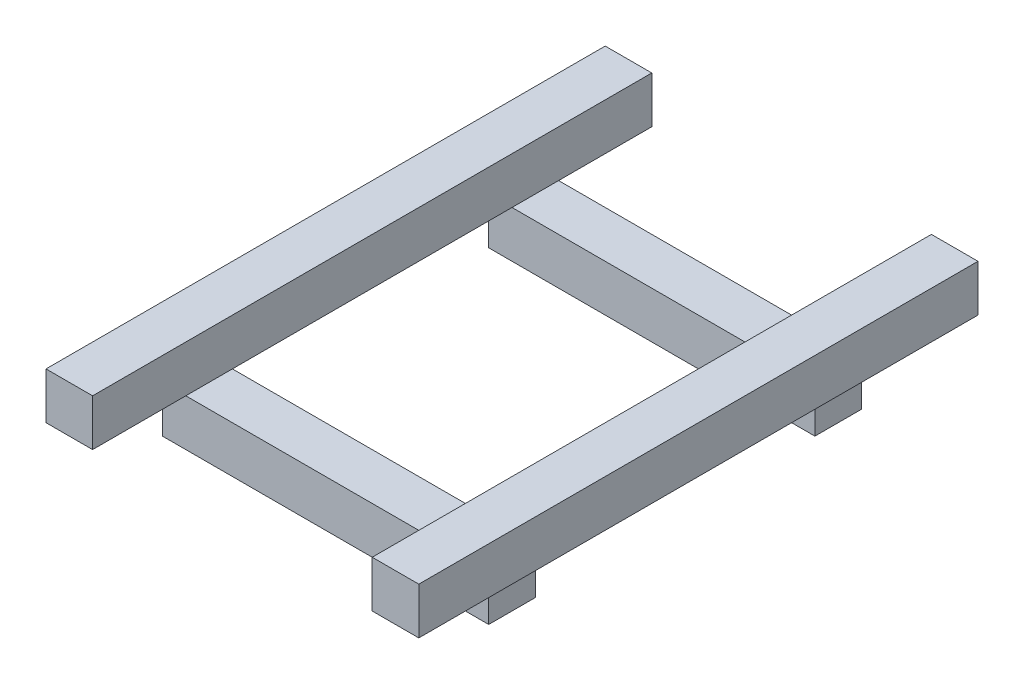
ISO-10303-21;
HEADER;
FILE_DESCRIPTION(('STEP AP214'),'2;1');
FILE_NAME('part.step','',(''),(''),'','','');
FILE_SCHEMA(('AUTOMOTIVE_DESIGN { 1 0 10303 214 1 1 1 1 }'));
ENDSEC;
DATA;
#1=APPLICATION_CONTEXT('core data for automotive mechanical design processes');
#2=APPLICATION_PROTOCOL_DEFINITION('international standard','automotive_design',2000,#1);
#3=PRODUCT_CONTEXT('',#1,'mechanical');
#4=PRODUCT('Part','Part','',(#3));
#5=PRODUCT_RELATED_PRODUCT_CATEGORY('part','',(#4));
#6=PRODUCT_DEFINITION_FORMATION('','',#4);
#7=PRODUCT_DEFINITION_CONTEXT('part definition',#1,'design');
#8=PRODUCT_DEFINITION('design','',#6,#7);
#9=PRODUCT_DEFINITION_SHAPE('','',#8);
#10=(LENGTH_UNIT() NAMED_UNIT(*) SI_UNIT(.MILLI.,.METRE.));
#11=(NAMED_UNIT(*) PLANE_ANGLE_UNIT() SI_UNIT($,.RADIAN.));
#12=(NAMED_UNIT(*) SI_UNIT($,.STERADIAN.) SOLID_ANGLE_UNIT());
#13=UNCERTAINTY_MEASURE_WITH_UNIT(LENGTH_MEASURE(1.E-05),#10,'distance_accuracy_value','');
#14=(GEOMETRIC_REPRESENTATION_CONTEXT(3) GLOBAL_UNCERTAINTY_ASSIGNED_CONTEXT((#13)) GLOBAL_UNIT_ASSIGNED_CONTEXT((#10,
#11,#12)) REPRESENTATION_CONTEXT('',''));
#15=CARTESIAN_POINT('',(0.,0.,0.));
#16=DIRECTION('',(0.,0.,1.));
#17=DIRECTION('',(1.,0.,0.));
#18=AXIS2_PLACEMENT_3D('',#15,#16,#17);
#19=CARTESIAN_POINT('',(268.067226890756,-50.,329.201680672269));
#20=DIRECTION('',(-1.,0.,0.));
#21=DIRECTION('',(0.,0.,1.));
#22=AXIS2_PLACEMENT_3D('',#19,#20,#21);
#23=PLANE('',#22);
#24=DIRECTION('',(0.,0.,-1.));
#25=VECTOR('',#24,1.);
#26=CARTESIAN_POINT('',(268.067226890756,0.,-170.798319327731));
#27=LINE('',#26,#25);
#28=CARTESIAN_POINT('',(268.067226890756,0.,429.201680672269));
#29=VERTEX_POINT('',#28);
#30=CARTESIAN_POINT('',(268.067226890756,0.,-170.798319327731));
#31=VERTEX_POINT('',#30);
#32=EDGE_CURVE('E231',#29,#31,#27,.T.);
#33=ORIENTED_EDGE('',*,*,#32,.T.);
#34=DIRECTION('',(0.,-1.,0.));
#35=VECTOR('',#34,1.);
#36=CARTESIAN_POINT('',(268.067226890756,50.,-170.798319327731));
#37=LINE('',#36,#35);
#38=CARTESIAN_POINT('',(268.067226890756,50.,-170.798319327731));
#39=VERTEX_POINT('',#38);
#40=EDGE_CURVE('E222',#39,#31,#37,.T.);
#41=ORIENTED_EDGE('',*,*,#40,.F.);
#42=DIRECTION('',(0.,0.,-1.));
#43=VECTOR('',#42,1.);
#44=CARTESIAN_POINT('',(268.067226890756,50.,-170.798319327731));
#45=LINE('',#44,#43);
#46=CARTESIAN_POINT('',(268.067226890756,50.,429.201680672269));
#47=VERTEX_POINT('',#46);
#48=EDGE_CURVE('E243',#47,#39,#45,.T.);
#49=ORIENTED_EDGE('',*,*,#48,.F.);
#50=DIRECTION('',(0.,-1.,0.));
#51=VECTOR('',#50,1.);
#52=CARTESIAN_POINT('',(268.067226890756,50.,429.201680672269));
#53=LINE('',#52,#51);
#54=EDGE_CURVE('E215',#47,#29,#53,.T.);
#55=ORIENTED_EDGE('',*,*,#54,.T.);
#56=EDGE_LOOP('',(#33,#41,#49,#55));
#57=FACE_BOUND('',#56,.T.);
#58=ADVANCED_FACE('F39',(#57),#23,.F.);
#59=CARTESIAN_POINT('',(0.,0.,0.));
#60=DIRECTION('',(0.,-1.,0.));
#61=DIRECTION('',(0.,0.,-1.));
#62=AXIS2_PLACEMENT_3D('',#59,#60,#61);
#63=PLANE('',#62);
#64=DIRECTION('',(0.,0.,1.));
#65=VECTOR('',#64,1.);
#66=CARTESIAN_POINT('',(218.067226890756,0.,0.));
#67=LINE('',#66,#65);
#68=CARTESIAN_POINT('',(218.067226890756,0.,279.201680672269));
#69=VERTEX_POINT('',#68);
#70=CARTESIAN_POINT('',(218.067226890756,0.,329.201680672269));
#71=VERTEX_POINT('',#70);
#72=EDGE_CURVE('E47',#69,#71,#67,.T.);
#73=ORIENTED_EDGE('',*,*,#72,.F.);
#74=DIRECTION('',(1.,0.,0.));
#75=VECTOR('',#74,1.);
#76=CARTESIAN_POINT('',(-131.932773109244,0.,279.201680672269));
#77=LINE('',#76,#75);
#78=CARTESIAN_POINT('',(-81.9327731092437,0.,279.201680672269));
#79=VERTEX_POINT('',#78);
#80=EDGE_CURVE('E260',#79,#69,#77,.T.);
#81=ORIENTED_EDGE('',*,*,#80,.F.);
#82=DIRECTION('',(0.,0.,-1.));
#83=VECTOR('',#82,1.);
#84=CARTESIAN_POINT('',(-81.9327731092436,0.,-170.798319327731));
#85=LINE('',#84,#83);
#86=CARTESIAN_POINT('',(-81.9327731092436,0.,329.201680672269));
#87=VERTEX_POINT('',#86);
#88=EDGE_CURVE('E281',#87,#79,#85,.T.);
#89=ORIENTED_EDGE('',*,*,#88,.F.);
#90=DIRECTION('',(-1.,0.,0.));
#91=VECTOR('',#90,1.);
#92=CARTESIAN_POINT('',(-131.932773109244,0.,329.201680672269));
#93=LINE('',#92,#91);
#94=EDGE_CURVE('E259',#71,#87,#93,.T.);
#95=ORIENTED_EDGE('',*,*,#94,.F.);
#96=EDGE_LOOP('',(#73,#81,#89,#95));
#97=FACE_BOUND('',#96,.T.);
#98=ADVANCED_FACE('F320',(#97),#63,.F.);
#99=CARTESIAN_POINT('',(0.,0.,0.));
#100=DIRECTION('',(0.,1.,0.));
#101=DIRECTION('',(0.,0.,1.));
#102=AXIS2_PLACEMENT_3D('',#99,#100,#101);
#103=PLANE('',#102);
#104=CARTESIAN_POINT('',(-106.932773109244,0.,329.201680672269));
#105=VERTEX_POINT('',#104);
#106=EDGE_CURVE('E262',#87,#105,#93,.T.);
#107=ORIENTED_EDGE('',*,*,#106,.F.);
#108=CARTESIAN_POINT('',(-81.9327731092436,0.,429.201680672269));
#109=VERTEX_POINT('',#108);
#110=EDGE_CURVE('E278',#109,#87,#85,.T.);
#111=ORIENTED_EDGE('',*,*,#110,.F.);
#112=DIRECTION('',(1.,0.,0.));
#113=VECTOR('',#112,1.);
#114=CARTESIAN_POINT('',(-131.932773109244,0.,429.201680672269));
#115=LINE('',#114,#113);
#116=CARTESIAN_POINT('',(-131.932773109244,0.,429.201680672269));
#117=VERTEX_POINT('',#116);
#118=EDGE_CURVE('E275',#117,#109,#115,.T.);
#119=ORIENTED_EDGE('',*,*,#118,.F.);
#120=DIRECTION('',(0.,0.,1.));
#121=VECTOR('',#120,1.);
#122=CARTESIAN_POINT('',(-131.932773109244,0.,-170.798319327731));
#123=LINE('',#122,#121);
#124=CARTESIAN_POINT('',(-131.932773109244,0.,-170.798319327731));
#125=VERTEX_POINT('',#124);
#126=EDGE_CURVE('E256',#125,#117,#123,.T.);
#127=ORIENTED_EDGE('',*,*,#126,.F.);
#128=DIRECTION('',(-1.,0.,0.));
#129=VECTOR('',#128,1.);
#130=CARTESIAN_POINT('',(-131.932773109244,0.,-170.798319327731));
#131=LINE('',#130,#129);
#132=CARTESIAN_POINT('',(-81.9327731092436,0.,-170.798319327731));
#133=VERTEX_POINT('',#132);
#134=EDGE_CURVE('E267',#133,#125,#131,.T.);
#135=ORIENTED_EDGE('',*,*,#134,.F.);
#136=CARTESIAN_POINT('',(-81.9327731092436,0.,-70.7983193277311));
#137=VERTEX_POINT('',#136);
#138=EDGE_CURVE('E277',#137,#133,#85,.T.);
#139=ORIENTED_EDGE('',*,*,#138,.F.);
#140=DIRECTION('',(1.,0.,0.));
#141=VECTOR('',#140,1.);
#142=CARTESIAN_POINT('',(-131.932773109244,0.,-70.7983193277311));
#143=LINE('',#142,#141);
#144=CARTESIAN_POINT('',(-106.932773109244,0.,-70.7983193277311));
#145=VERTEX_POINT('',#144);
#146=EDGE_CURVE('E201',#145,#137,#143,.T.);
#147=ORIENTED_EDGE('',*,*,#146,.F.);
#148=DIRECTION('',(0.,0.,1.));
#149=VECTOR('',#148,1.);
#150=CARTESIAN_POINT('',(-106.932773109244,0.,329.201680672269));
#151=LINE('',#150,#149);
#152=CARTESIAN_POINT('',(-106.932773109244,0.,-20.798319327731));
#153=VERTEX_POINT('',#152);
#154=EDGE_CURVE('E533',#145,#153,#151,.T.);
#155=ORIENTED_EDGE('',*,*,#154,.T.);
#156=DIRECTION('',(-1.,0.,0.));
#157=VECTOR('',#156,1.);
#158=CARTESIAN_POINT('',(-131.932773109244,0.,-20.7983193277311));
#159=LINE('',#158,#157);
#160=CARTESIAN_POINT('',(-81.9327731092436,0.,-20.7983193277311));
#161=VERTEX_POINT('',#160);
#162=EDGE_CURVE('E204',#161,#153,#159,.T.);
#163=ORIENTED_EDGE('',*,*,#162,.F.);
#164=EDGE_CURVE('E322',#79,#161,#85,.T.);
#165=ORIENTED_EDGE('',*,*,#164,.F.);
#166=CARTESIAN_POINT('',(-106.932773109244,0.,279.201680672269));
#167=VERTEX_POINT('',#166);
#168=EDGE_CURVE('E257',#167,#79,#77,.T.);
#169=ORIENTED_EDGE('',*,*,#168,.F.);
#170=EDGE_CURVE('E312',#167,#105,#151,.T.);
#171=ORIENTED_EDGE('',*,*,#170,.T.);
#172=EDGE_LOOP('',(#107,#111,#119,#127,#135,#139,#147,#155,#163,#165,#169,#171));
#173=FACE_BOUND('',#172,.T.);
#174=ADVANCED_FACE('F309',(#173),#103,.F.);
#175=CARTESIAN_POINT('',(-131.932773109244,50.,-170.798319327731));
#176=DIRECTION('',(1.,0.,0.));
#177=DIRECTION('',(0.,0.,-1.));
#178=AXIS2_PLACEMENT_3D('',#175,#176,#177);
#179=PLANE('',#178);
#180=ORIENTED_EDGE('',*,*,#126,.T.);
#181=DIRECTION('',(0.,-1.,0.));
#182=VECTOR('',#181,1.);
#183=CARTESIAN_POINT('',(-131.932773109244,50.,429.201680672269));
#184=LINE('',#183,#182);
#185=CARTESIAN_POINT('',(-131.932773109244,50.,429.201680672269));
#186=VERTEX_POINT('',#185);
#187=EDGE_CURVE('E291',#186,#117,#184,.T.);
#188=ORIENTED_EDGE('',*,*,#187,.F.);
#189=DIRECTION('',(0.,0.,1.));
#190=VECTOR('',#189,1.);
#191=CARTESIAN_POINT('',(-131.932773109244,50.,-170.798319327731));
#192=LINE('',#191,#190);
#193=CARTESIAN_POINT('',(-131.932773109244,50.,-170.798319327731));
#194=VERTEX_POINT('',#193);
#195=EDGE_CURVE('E263',#194,#186,#192,.T.);
#196=ORIENTED_EDGE('',*,*,#195,.F.);
#197=DIRECTION('',(0.,-1.,0.));
#198=VECTOR('',#197,1.);
#199=CARTESIAN_POINT('',(-131.932773109244,50.,-170.798319327731));
#200=LINE('',#199,#198);
#201=EDGE_CURVE('E273',#194,#125,#200,.T.);
#202=ORIENTED_EDGE('',*,*,#201,.T.);
#203=EDGE_LOOP('',(#180,#188,#196,#202));
#204=FACE_BOUND('',#203,.T.);
#205=ADVANCED_FACE('F41',(#204),#179,.F.);
#206=CARTESIAN_POINT('',(-131.932773109244,50.,429.201680672269));
#207=DIRECTION('',(0.,0.,-1.));
#208=DIRECTION('',(-1.,0.,0.));
#209=AXIS2_PLACEMENT_3D('',#206,#207,#208);
#210=PLANE('',#209);
#211=ORIENTED_EDGE('',*,*,#118,.T.);
#212=DIRECTION('',(0.,-1.,0.));
#213=VECTOR('',#212,1.);
#214=CARTESIAN_POINT('',(-81.9327731092436,50.,429.201680672269));
#215=LINE('',#214,#213);
#216=CARTESIAN_POINT('',(-81.9327731092436,50.,429.201680672269));
#217=VERTEX_POINT('',#216);
#218=EDGE_CURVE('E288',#217,#109,#215,.T.);
#219=ORIENTED_EDGE('',*,*,#218,.F.);
#220=DIRECTION('',(1.,0.,0.));
#221=VECTOR('',#220,1.);
#222=CARTESIAN_POINT('',(-131.932773109244,50.,429.201680672269));
#223=LINE('',#222,#221);
#224=EDGE_CURVE('E266',#186,#217,#223,.T.);
#225=ORIENTED_EDGE('',*,*,#224,.F.);
#226=ORIENTED_EDGE('',*,*,#187,.T.);
#227=EDGE_LOOP('',(#211,#219,#225,#226));
#228=FACE_BOUND('',#227,.T.);
#229=ADVANCED_FACE('F337',(#228),#210,.F.);
#230=CARTESIAN_POINT('',(-81.9327731092436,50.,-170.798319327731));
#231=DIRECTION('',(-1.,0.,0.));
#232=DIRECTION('',(0.,0.,1.));
#233=AXIS2_PLACEMENT_3D('',#230,#231,#232);
#234=PLANE('',#233);
#235=ORIENTED_EDGE('',*,*,#110,.T.);
#236=ORIENTED_EDGE('',*,*,#88,.T.);
#237=ORIENTED_EDGE('',*,*,#164,.T.);
#238=DIRECTION('',(0.,0.,-1.));
#239=VECTOR('',#238,1.);
#240=CARTESIAN_POINT('',(-81.9327731092436,0.,-170.798319327731));
#241=LINE('',#240,#239);
#242=EDGE_CURVE('E206',#161,#137,#241,.T.);
#243=ORIENTED_EDGE('',*,*,#242,.T.);
#244=ORIENTED_EDGE('',*,*,#138,.T.);
#245=DIRECTION('',(0.,-1.,0.));
#246=VECTOR('',#245,1.);
#247=CARTESIAN_POINT('',(-81.9327731092436,50.,-170.798319327731));
#248=LINE('',#247,#246);
#249=CARTESIAN_POINT('',(-81.9327731092436,50.,-170.798319327731));
#250=VERTEX_POINT('',#249);
#251=EDGE_CURVE('E285',#250,#133,#248,.T.);
#252=ORIENTED_EDGE('',*,*,#251,.F.);
#253=DIRECTION('',(0.,0.,-1.));
#254=VECTOR('',#253,1.);
#255=CARTESIAN_POINT('',(-81.9327731092436,50.,-170.798319327731));
#256=LINE('',#255,#254);
#257=EDGE_CURVE('E269',#217,#250,#256,.T.);
#258=ORIENTED_EDGE('',*,*,#257,.F.);
#259=ORIENTED_EDGE('',*,*,#218,.T.);
#260=EDGE_LOOP('',(#235,#236,#237,#243,#244,#252,#258,#259));
#261=FACE_BOUND('',#260,.T.);
#262=ADVANCED_FACE('F315',(#261),#234,.F.);
#263=CARTESIAN_POINT('',(-131.932773109244,50.,-170.798319327731));
#264=DIRECTION('',(0.,0.,1.));
#265=DIRECTION('',(1.,0.,0.));
#266=AXIS2_PLACEMENT_3D('',#263,#264,#265);
#267=PLANE('',#266);
#268=ORIENTED_EDGE('',*,*,#134,.T.);
#269=ORIENTED_EDGE('',*,*,#201,.F.);
#270=DIRECTION('',(-1.,0.,0.));
#271=VECTOR('',#270,1.);
#272=CARTESIAN_POINT('',(-131.932773109244,50.,-170.798319327731));
#273=LINE('',#272,#271);
#274=EDGE_CURVE('E271',#250,#194,#273,.T.);
#275=ORIENTED_EDGE('',*,*,#274,.F.);
#276=ORIENTED_EDGE('',*,*,#251,.T.);
#277=EDGE_LOOP('',(#268,#269,#275,#276));
#278=FACE_BOUND('',#277,.T.);
#279=ADVANCED_FACE('F328',(#278),#267,.F.);
#280=CARTESIAN_POINT('',(0.,50.,0.));
#281=DIRECTION('',(0.,1.,0.));
#282=DIRECTION('',(0.,0.,1.));
#283=AXIS2_PLACEMENT_3D('',#280,#281,#282);
#284=PLANE('',#283);
#285=ORIENTED_EDGE('',*,*,#195,.T.);
#286=ORIENTED_EDGE('',*,*,#224,.T.);
#287=ORIENTED_EDGE('',*,*,#257,.T.);
#288=ORIENTED_EDGE('',*,*,#274,.T.);
#289=EDGE_LOOP('',(#285,#286,#287,#288));
#290=FACE_BOUND('',#289,.T.);
#291=ADVANCED_FACE('F335',(#290),#284,.T.);
#292=CARTESIAN_POINT('',(-131.932773109244,-50.,279.201680672269));
#293=DIRECTION('',(0.,0.,1.));
#294=DIRECTION('',(1.,0.,0.));
#295=AXIS2_PLACEMENT_3D('',#292,#293,#294);
#296=PLANE('',#295);
#297=CARTESIAN_POINT('',(243.067226890756,0.,279.201680672269));
#298=VERTEX_POINT('',#297);
#299=EDGE_CURVE('E239',#69,#298,#77,.T.);
#300=ORIENTED_EDGE('',*,*,#299,.T.);
#301=DIRECTION('',(0.,-1.,0.));
#302=VECTOR('',#301,1.);
#303=CARTESIAN_POINT('',(243.067226890756,-50.,279.201680672269));
#304=LINE('',#303,#302);
#305=CARTESIAN_POINT('',(243.067226890756,-50.,279.201680672269));
#306=VERTEX_POINT('',#305);
#307=EDGE_CURVE('E546',#298,#306,#304,.T.);
#308=ORIENTED_EDGE('',*,*,#307,.T.);
#309=DIRECTION('',(1.,0.,0.));
#310=VECTOR('',#309,1.);
#311=CARTESIAN_POINT('',(-131.932773109244,-50.,279.201680672269));
#312=LINE('',#311,#310);
#313=CARTESIAN_POINT('',(-106.932773109244,-50.,279.201680672269));
#314=VERTEX_POINT('',#313);
#315=EDGE_CURVE('E249',#314,#306,#312,.T.);
#316=ORIENTED_EDGE('',*,*,#315,.F.);
#317=DIRECTION('',(0.,1.,0.));
#318=VECTOR('',#317,1.);
#319=CARTESIAN_POINT('',(-106.932773109244,-50.,279.201680672269));
#320=LINE('',#319,#318);
#321=EDGE_CURVE('E54',#314,#167,#320,.T.);
#322=ORIENTED_EDGE('',*,*,#321,.T.);
#323=ORIENTED_EDGE('',*,*,#168,.T.);
#324=ORIENTED_EDGE('',*,*,#80,.T.);
#325=EDGE_LOOP('',(#300,#308,#316,#322,#323,#324));
#326=FACE_BOUND('',#325,.T.);
#327=ADVANCED_FACE('F356',(#326),#296,.F.);
#328=CARTESIAN_POINT('',(-131.932773109244,-50.,329.201680672269));
#329=DIRECTION('',(0.,0.,-1.));
#330=DIRECTION('',(-1.,0.,0.));
#331=AXIS2_PLACEMENT_3D('',#328,#329,#330);
#332=PLANE('',#331);
#333=DIRECTION('',(-1.,0.,0.));
#334=VECTOR('',#333,1.);
#335=CARTESIAN_POINT('',(-131.932773109244,-50.,329.201680672269));
#336=LINE('',#335,#334);
#337=CARTESIAN_POINT('',(243.067226890756,-50.,329.201680672269));
#338=VERTEX_POINT('',#337);
#339=CARTESIAN_POINT('',(-106.932773109244,-50.,329.201680672269));
#340=VERTEX_POINT('',#339);
#341=EDGE_CURVE('E252',#338,#340,#336,.T.);
#342=ORIENTED_EDGE('',*,*,#341,.F.);
#343=DIRECTION('',(0.,-1.,0.));
#344=VECTOR('',#343,1.);
#345=CARTESIAN_POINT('',(243.067226890756,0.,329.201680672269));
#346=LINE('',#345,#344);
#347=CARTESIAN_POINT('',(243.067226890756,0.,329.201680672269));
#348=VERTEX_POINT('',#347);
#349=EDGE_CURVE('E194',#348,#338,#346,.T.);
#350=ORIENTED_EDGE('',*,*,#349,.F.);
#351=EDGE_CURVE('E253',#348,#71,#93,.T.);
#352=ORIENTED_EDGE('',*,*,#351,.T.);
#353=ORIENTED_EDGE('',*,*,#94,.T.);
#354=ORIENTED_EDGE('',*,*,#106,.T.);
#355=DIRECTION('',(0.,-1.,0.));
#356=VECTOR('',#355,1.);
#357=CARTESIAN_POINT('',(-106.932773109244,0.,329.201680672269));
#358=LINE('',#357,#356);
#359=EDGE_CURVE('E530',#105,#340,#358,.T.);
#360=ORIENTED_EDGE('',*,*,#359,.T.);
#361=EDGE_LOOP('',(#342,#350,#352,#353,#354,#360));
#362=FACE_BOUND('',#361,.T.);
#363=ADVANCED_FACE('F302',(#362),#332,.F.);
#364=CARTESIAN_POINT('',(0.,-50.,0.));
#365=DIRECTION('',(0.,-1.,0.));
#366=DIRECTION('',(0.,0.,-1.));
#367=AXIS2_PLACEMENT_3D('',#364,#365,#366);
#368=PLANE('',#367);
#369=DIRECTION('',(0.,0.,-1.));
#370=VECTOR('',#369,1.);
#371=CARTESIAN_POINT('',(243.067226890756,-50.,329.201680672269));
#372=LINE('',#371,#370);
#373=EDGE_CURVE('E186',#338,#306,#372,.T.);
#374=ORIENTED_EDGE('',*,*,#373,.F.);
#375=ORIENTED_EDGE('',*,*,#341,.T.);
#376=DIRECTION('',(0.,0.,1.));
#377=VECTOR('',#376,1.);
#378=CARTESIAN_POINT('',(-106.932773109244,-50.,329.201680672269));
#379=LINE('',#378,#377);
#380=EDGE_CURVE('E538',#314,#340,#379,.T.);
#381=ORIENTED_EDGE('',*,*,#380,.F.);
#382=ORIENTED_EDGE('',*,*,#315,.T.);
#383=EDGE_LOOP('',(#374,#375,#381,#382));
#384=FACE_BOUND('',#383,.T.);
#385=ADVANCED_FACE('F430',(#384),#368,.T.);
#386=CARTESIAN_POINT('',(0.,0.,0.));
#387=DIRECTION('',(0.,1.,0.));
#388=DIRECTION('',(0.,0.,1.));
#389=AXIS2_PLACEMENT_3D('',#386,#387,#388);
#390=PLANE('',#389);
#391=DIRECTION('',(0.,0.,1.));
#392=VECTOR('',#391,1.);
#393=CARTESIAN_POINT('',(218.067226890756,0.,-170.798319327731));
#394=LINE('',#393,#392);
#395=CARTESIAN_POINT('',(218.067226890756,0.,429.201680672269));
#396=VERTEX_POINT('',#395);
#397=EDGE_CURVE('E236',#71,#396,#394,.T.);
#398=ORIENTED_EDGE('',*,*,#397,.F.);
#399=ORIENTED_EDGE('',*,*,#351,.F.);
#400=DIRECTION('',(0.,0.,-1.));
#401=VECTOR('',#400,1.);
#402=CARTESIAN_POINT('',(243.067226890756,0.,329.201680672269));
#403=LINE('',#402,#401);
#404=EDGE_CURVE('E185',#348,#298,#403,.T.);
#405=ORIENTED_EDGE('',*,*,#404,.T.);
#406=ORIENTED_EDGE('',*,*,#299,.F.);
#407=CARTESIAN_POINT('',(218.067226890756,0.,-20.7983193277311));
#408=VERTEX_POINT('',#407);
#409=EDGE_CURVE('E241',#408,#69,#394,.T.);
#410=ORIENTED_EDGE('',*,*,#409,.F.);
#411=CARTESIAN_POINT('',(243.067226890756,0.,-20.798319327731));
#412=VERTEX_POINT('',#411);
#413=EDGE_CURVE('E184',#412,#408,#159,.T.);
#414=ORIENTED_EDGE('',*,*,#413,.F.);
#415=CARTESIAN_POINT('',(243.067226890756,0.,-70.7983193277311));
#416=VERTEX_POINT('',#415);
#417=EDGE_CURVE('E175',#412,#416,#403,.T.);
#418=ORIENTED_EDGE('',*,*,#417,.T.);
#419=CARTESIAN_POINT('',(218.067226890756,0.,-70.7983193277311));
#420=VERTEX_POINT('',#419);
#421=EDGE_CURVE('E181',#420,#416,#143,.T.);
#422=ORIENTED_EDGE('',*,*,#421,.F.);
#423=CARTESIAN_POINT('',(218.067226890756,0.,-170.798319327731));
#424=VERTEX_POINT('',#423);
#425=EDGE_CURVE('E237',#424,#420,#394,.T.);
#426=ORIENTED_EDGE('',*,*,#425,.F.);
#427=DIRECTION('',(-1.,0.,0.));
#428=VECTOR('',#427,1.);
#429=CARTESIAN_POINT('',(218.067226890756,0.,-170.798319327731));
#430=LINE('',#429,#428);
#431=EDGE_CURVE('E229',#31,#424,#430,.T.);
#432=ORIENTED_EDGE('',*,*,#431,.F.);
#433=ORIENTED_EDGE('',*,*,#32,.F.);
#434=DIRECTION('',(1.,0.,0.));
#435=VECTOR('',#434,1.);
#436=CARTESIAN_POINT('',(218.067226890756,0.,429.201680672269));
#437=LINE('',#436,#435);
#438=EDGE_CURVE('E234',#396,#29,#437,.T.);
#439=ORIENTED_EDGE('',*,*,#438,.F.);
#440=EDGE_LOOP('',(#398,#399,#405,#406,#410,#414,#418,#422,#426,#432,#433,#439));
#441=FACE_BOUND('',#440,.T.);
#442=ADVANCED_FACE('F178',(#441),#390,.F.);
#443=CARTESIAN_POINT('',(218.067226890756,50.,-170.798319327731));
#444=DIRECTION('',(1.,0.,0.));
#445=DIRECTION('',(0.,0.,-1.));
#446=AXIS2_PLACEMENT_3D('',#443,#444,#445);
#447=PLANE('',#446);
#448=ORIENTED_EDGE('',*,*,#425,.T.);
#449=EDGE_CURVE('E240',#420,#408,#394,.T.);
#450=ORIENTED_EDGE('',*,*,#449,.T.);
#451=ORIENTED_EDGE('',*,*,#409,.T.);
#452=ORIENTED_EDGE('',*,*,#72,.T.);
#453=ORIENTED_EDGE('',*,*,#397,.T.);
#454=DIRECTION('',(0.,-1.,0.));
#455=VECTOR('',#454,1.);
#456=CARTESIAN_POINT('',(218.067226890756,50.,429.201680672269));
#457=LINE('',#456,#455);
#458=CARTESIAN_POINT('',(218.067226890756,50.,429.201680672269));
#459=VERTEX_POINT('',#458);
#460=EDGE_CURVE('E210',#459,#396,#457,.T.);
#461=ORIENTED_EDGE('',*,*,#460,.F.);
#462=DIRECTION('',(0.,0.,1.));
#463=VECTOR('',#462,1.);
#464=CARTESIAN_POINT('',(218.067226890756,50.,-170.798319327731));
#465=LINE('',#464,#463);
#466=CARTESIAN_POINT('',(218.067226890756,50.,-170.798319327731));
#467=VERTEX_POINT('',#466);
#468=EDGE_CURVE('E232',#467,#459,#465,.T.);
#469=ORIENTED_EDGE('',*,*,#468,.F.);
#470=DIRECTION('',(0.,-1.,0.));
#471=VECTOR('',#470,1.);
#472=CARTESIAN_POINT('',(218.067226890756,50.,-170.798319327731));
#473=LINE('',#472,#471);
#474=EDGE_CURVE('E225',#467,#424,#473,.T.);
#475=ORIENTED_EDGE('',*,*,#474,.T.);
#476=EDGE_LOOP('',(#448,#450,#451,#452,#453,#461,#469,#475));
#477=FACE_BOUND('',#476,.T.);
#478=ADVANCED_FACE('F387',(#477),#447,.F.);
#479=CARTESIAN_POINT('',(218.067226890756,50.,429.201680672269));
#480=DIRECTION('',(0.,0.,-1.));
#481=DIRECTION('',(-1.,0.,0.));
#482=AXIS2_PLACEMENT_3D('',#479,#480,#481);
#483=PLANE('',#482);
#484=ORIENTED_EDGE('',*,*,#438,.T.);
#485=ORIENTED_EDGE('',*,*,#54,.F.);
#486=DIRECTION('',(1.,0.,0.));
#487=VECTOR('',#486,1.);
#488=CARTESIAN_POINT('',(218.067226890756,50.,429.201680672269));
#489=LINE('',#488,#487);
#490=EDGE_CURVE('E245',#459,#47,#489,.T.);
#491=ORIENTED_EDGE('',*,*,#490,.F.);
#492=ORIENTED_EDGE('',*,*,#460,.T.);
#493=EDGE_LOOP('',(#484,#485,#491,#492));
#494=FACE_BOUND('',#493,.T.);
#495=ADVANCED_FACE('F391',(#494),#483,.F.);
#496=CARTESIAN_POINT('',(218.067226890756,50.,-170.798319327731));
#497=DIRECTION('',(0.,0.,1.));
#498=DIRECTION('',(1.,0.,0.));
#499=AXIS2_PLACEMENT_3D('',#496,#497,#498);
#500=PLANE('',#499);
#501=ORIENTED_EDGE('',*,*,#431,.T.);
#502=ORIENTED_EDGE('',*,*,#474,.F.);
#503=DIRECTION('',(-1.,0.,0.));
#504=VECTOR('',#503,1.);
#505=CARTESIAN_POINT('',(218.067226890756,50.,-170.798319327731));
#506=LINE('',#505,#504);
#507=EDGE_CURVE('E228',#39,#467,#506,.T.);
#508=ORIENTED_EDGE('',*,*,#507,.F.);
#509=ORIENTED_EDGE('',*,*,#40,.T.);
#510=EDGE_LOOP('',(#501,#502,#508,#509));
#511=FACE_BOUND('',#510,.T.);
#512=ADVANCED_FACE('F399',(#511),#500,.F.);
#513=CARTESIAN_POINT('',(0.,50.,0.));
#514=DIRECTION('',(0.,1.,0.));
#515=DIRECTION('',(0.,0.,1.));
#516=AXIS2_PLACEMENT_3D('',#513,#514,#515);
#517=PLANE('',#516);
#518=ORIENTED_EDGE('',*,*,#468,.T.);
#519=ORIENTED_EDGE('',*,*,#490,.T.);
#520=ORIENTED_EDGE('',*,*,#48,.T.);
#521=ORIENTED_EDGE('',*,*,#507,.T.);
#522=EDGE_LOOP('',(#518,#519,#520,#521));
#523=FACE_BOUND('',#522,.T.);
#524=ADVANCED_FACE('F407',(#523),#517,.T.);
#525=CARTESIAN_POINT('',(0.,0.,0.));
#526=DIRECTION('',(0.,1.,0.));
#527=DIRECTION('',(0.,0.,1.));
#528=AXIS2_PLACEMENT_3D('',#525,#526,#527);
#529=PLANE('',#528);
#530=ORIENTED_EDGE('',*,*,#242,.F.);
#531=EDGE_CURVE('E202',#408,#161,#159,.T.);
#532=ORIENTED_EDGE('',*,*,#531,.F.);
#533=ORIENTED_EDGE('',*,*,#449,.F.);
#534=EDGE_CURVE('E199',#137,#420,#143,.T.);
#535=ORIENTED_EDGE('',*,*,#534,.F.);
#536=EDGE_LOOP('',(#530,#532,#533,#535));
#537=FACE_BOUND('',#536,.T.);
#538=ADVANCED_FACE('F414',(#537),#529,.T.);
#539=CARTESIAN_POINT('',(-131.932773109244,-50.,-70.7983193277311));
#540=DIRECTION('',(0.,0.,1.));
#541=DIRECTION('',(1.,0.,0.));
#542=AXIS2_PLACEMENT_3D('',#539,#540,#541);
#543=PLANE('',#542);
#544=ORIENTED_EDGE('',*,*,#421,.T.);
#545=DIRECTION('',(0.,-1.,0.));
#546=VECTOR('',#545,1.);
#547=CARTESIAN_POINT('',(243.067226890756,0.,-70.7983193277311));
#548=LINE('',#547,#546);
#549=CARTESIAN_POINT('',(243.067226890756,-50.,-70.7983193277311));
#550=VERTEX_POINT('',#549);
#551=EDGE_CURVE('E189',#416,#550,#548,.T.);
#552=ORIENTED_EDGE('',*,*,#551,.T.);
#553=DIRECTION('',(1.,0.,0.));
#554=VECTOR('',#553,1.);
#555=CARTESIAN_POINT('',(-131.932773109244,-50.,-70.7983193277311));
#556=LINE('',#555,#554);
#557=CARTESIAN_POINT('',(-106.932773109244,-50.,-70.7983193277311));
#558=VERTEX_POINT('',#557);
#559=EDGE_CURVE('E218',#558,#550,#556,.T.);
#560=ORIENTED_EDGE('',*,*,#559,.F.);
#561=DIRECTION('',(0.,-1.,0.));
#562=VECTOR('',#561,1.);
#563=CARTESIAN_POINT('',(-106.932773109244,0.,-70.7983193277311));
#564=LINE('',#563,#562);
#565=EDGE_CURVE('E531',#145,#558,#564,.T.);
#566=ORIENTED_EDGE('',*,*,#565,.F.);
#567=ORIENTED_EDGE('',*,*,#146,.T.);
#568=ORIENTED_EDGE('',*,*,#534,.T.);
#569=EDGE_LOOP('',(#544,#552,#560,#566,#567,#568));
#570=FACE_BOUND('',#569,.T.);
#571=ADVANCED_FACE('F197',(#570),#543,.F.);
#572=CARTESIAN_POINT('',(-131.932773109244,-50.,-20.7983193277311));
#573=DIRECTION('',(0.,0.,-1.));
#574=DIRECTION('',(-1.,0.,0.));
#575=AXIS2_PLACEMENT_3D('',#572,#573,#574);
#576=PLANE('',#575);
#577=DIRECTION('',(-1.,0.,0.));
#578=VECTOR('',#577,1.);
#579=CARTESIAN_POINT('',(-131.932773109244,-50.,-20.7983193277311));
#580=LINE('',#579,#578);
#581=CARTESIAN_POINT('',(243.067226890756,-50.,-20.7983193277311));
#582=VERTEX_POINT('',#581);
#583=CARTESIAN_POINT('',(-106.932773109244,-50.,-20.798319327731));
#584=VERTEX_POINT('',#583);
#585=EDGE_CURVE('E547',#582,#584,#580,.T.);
#586=ORIENTED_EDGE('',*,*,#585,.F.);
#587=DIRECTION('',(0.,1.,0.));
#588=VECTOR('',#587,1.);
#589=CARTESIAN_POINT('',(243.067226890756,-50.,-20.7983193277311));
#590=LINE('',#589,#588);
#591=EDGE_CURVE('E62',#582,#412,#590,.T.);
#592=ORIENTED_EDGE('',*,*,#591,.T.);
#593=ORIENTED_EDGE('',*,*,#413,.T.);
#594=ORIENTED_EDGE('',*,*,#531,.T.);
#595=ORIENTED_EDGE('',*,*,#162,.T.);
#596=DIRECTION('',(0.,-1.,0.));
#597=VECTOR('',#596,1.);
#598=CARTESIAN_POINT('',(-106.932773109244,-50.,-20.7983193277311));
#599=LINE('',#598,#597);
#600=EDGE_CURVE('E541',#153,#584,#599,.T.);
#601=ORIENTED_EDGE('',*,*,#600,.T.);
#602=EDGE_LOOP('',(#586,#592,#593,#594,#595,#601));
#603=FACE_BOUND('',#602,.T.);
#604=ADVANCED_FACE('F439',(#603),#576,.F.);
#605=CARTESIAN_POINT('',(0.,-50.,0.));
#606=DIRECTION('',(0.,1.,0.));
#607=DIRECTION('',(0.,0.,1.));
#608=AXIS2_PLACEMENT_3D('',#605,#606,#607);
#609=PLANE('',#608);
#610=ORIENTED_EDGE('',*,*,#559,.T.);
#611=DIRECTION('',(0.,0.,1.));
#612=VECTOR('',#611,1.);
#613=CARTESIAN_POINT('',(243.067226890756,-50.,0.));
#614=LINE('',#613,#612);
#615=EDGE_CURVE('E11',#550,#582,#614,.T.);
#616=ORIENTED_EDGE('',*,*,#615,.T.);
#617=ORIENTED_EDGE('',*,*,#585,.T.);
#618=EDGE_CURVE('E528',#558,#584,#379,.T.);
#619=ORIENTED_EDGE('',*,*,#618,.F.);
#620=EDGE_LOOP('',(#610,#616,#617,#619));
#621=FACE_BOUND('',#620,.T.);
#622=ADVANCED_FACE('F449',(#621),#609,.F.);
#623=CARTESIAN_POINT('',(-106.932773109244,0.,329.201680672269));
#624=DIRECTION('',(1.,0.,0.));
#625=DIRECTION('',(0.,0.,-1.));
#626=AXIS2_PLACEMENT_3D('',#623,#624,#625);
#627=PLANE('',#626);
#628=ORIENTED_EDGE('',*,*,#154,.F.);
#629=ORIENTED_EDGE('',*,*,#565,.T.);
#630=ORIENTED_EDGE('',*,*,#618,.T.);
#631=ORIENTED_EDGE('',*,*,#600,.F.);
#632=EDGE_LOOP('',(#628,#629,#630,#631));
#633=FACE_BOUND('',#632,.T.);
#634=ADVANCED_FACE('F459',(#633),#627,.F.);
#635=CARTESIAN_POINT('',(243.067226890756,0.,329.201680672269));
#636=DIRECTION('',(-1.,0.,0.));
#637=DIRECTION('',(0.,0.,1.));
#638=AXIS2_PLACEMENT_3D('',#635,#636,#637);
#639=PLANE('',#638);
#640=ORIENTED_EDGE('',*,*,#615,.F.);
#641=ORIENTED_EDGE('',*,*,#551,.F.);
#642=ORIENTED_EDGE('',*,*,#417,.F.);
#643=ORIENTED_EDGE('',*,*,#591,.F.);
#644=EDGE_LOOP('',(#640,#641,#642,#643));
#645=FACE_BOUND('',#644,.T.);
#646=ADVANCED_FACE('F190',(#645),#639,.F.);
#647=ORIENTED_EDGE('',*,*,#404,.F.);
#648=ORIENTED_EDGE('',*,*,#349,.T.);
#649=ORIENTED_EDGE('',*,*,#373,.T.);
#650=ORIENTED_EDGE('',*,*,#307,.F.);
#651=EDGE_LOOP('',(#647,#648,#649,#650));
#652=FACE_BOUND('',#651,.T.);
#653=ADVANCED_FACE('F503',(#652),#639,.F.);
#654=ORIENTED_EDGE('',*,*,#380,.T.);
#655=ORIENTED_EDGE('',*,*,#359,.F.);
#656=ORIENTED_EDGE('',*,*,#170,.F.);
#657=ORIENTED_EDGE('',*,*,#321,.F.);
#658=EDGE_LOOP('',(#654,#655,#656,#657));
#659=FACE_BOUND('',#658,.T.);
#660=ADVANCED_FACE('F495',(#659),#627,.F.);
#661=CLOSED_SHELL('',(#58,#98,#174,#205,#229,#262,#279,#291,#327,#363,#385,#442,#478,#495,#512,
#524,#538,#571,#604,#622,#634,#646,#653,#660));
#662=MANIFOLD_SOLID_BREP('B2',#661);
#663=ADVANCED_BREP_SHAPE_REPRESENTATION('',(#18,#662),#14);
#664=SHAPE_DEFINITION_REPRESENTATION(#9,#663);
ENDSEC;
END-ISO-10303-21;
